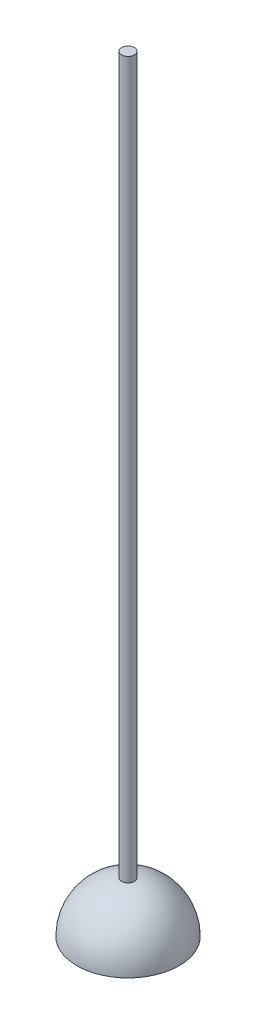
ISO-10303-21;
HEADER;
FILE_DESCRIPTION(('STEP AP214'),'2;1');
FILE_NAME('part.step','',(''),(''),'','','');
FILE_SCHEMA(('AUTOMOTIVE_DESIGN { 1 0 10303 214 1 1 1 1 }'));
ENDSEC;
DATA;
#1=APPLICATION_CONTEXT('core data for automotive mechanical design processes');
#2=APPLICATION_PROTOCOL_DEFINITION('international standard','automotive_design',2000,#1);
#3=PRODUCT_CONTEXT('',#1,'mechanical');
#4=PRODUCT('Part','Part','',(#3));
#5=PRODUCT_RELATED_PRODUCT_CATEGORY('part','',(#4));
#6=PRODUCT_DEFINITION_FORMATION('','',#4);
#7=PRODUCT_DEFINITION_CONTEXT('part definition',#1,'design');
#8=PRODUCT_DEFINITION('design','',#6,#7);
#9=PRODUCT_DEFINITION_SHAPE('','',#8);
#10=(LENGTH_UNIT() NAMED_UNIT(*) SI_UNIT(.MILLI.,.METRE.));
#11=(NAMED_UNIT(*) PLANE_ANGLE_UNIT() SI_UNIT($,.RADIAN.));
#12=(NAMED_UNIT(*) SI_UNIT($,.STERADIAN.) SOLID_ANGLE_UNIT());
#13=UNCERTAINTY_MEASURE_WITH_UNIT(LENGTH_MEASURE(1.E-05),#10,'distance_accuracy_value','');
#14=(GEOMETRIC_REPRESENTATION_CONTEXT(3) GLOBAL_UNCERTAINTY_ASSIGNED_CONTEXT((#13)) GLOBAL_UNIT_ASSIGNED_CONTEXT((#10,
#11,#12)) REPRESENTATION_CONTEXT('',''));
#15=CARTESIAN_POINT('',(0.,0.,0.));
#16=DIRECTION('',(0.,0.,1.));
#17=DIRECTION('',(1.,0.,0.));
#18=AXIS2_PLACEMENT_3D('',#15,#16,#17);
#19=CARTESIAN_POINT('',(0.,0.,0.));
#20=DIRECTION('',(0.,-1.,0.));
#21=DIRECTION('',(1.,0.,0.));
#22=AXIS2_PLACEMENT_3D('',#19,#20,#21);
#23=SPHERICAL_SURFACE('',#22,100.);
#24=CARTESIAN_POINT('',(0.,99.2156741649222,0.));
#25=DIRECTION('',(0.,-1.,0.));
#26=DIRECTION('',(0.,0.,-1.));
#27=AXIS2_PLACEMENT_3D('',#24,#25,#26);
#28=CIRCLE('',#27,12.5);
#29=CARTESIAN_POINT('',(0.,99.2156741649222,-12.5));
#30=VERTEX_POINT('',#29);
#31=EDGE_CURVE('E50',#30,#30,#28,.T.);
#32=ORIENTED_EDGE('',*,*,#31,.T.);
#33=EDGE_LOOP('',(#32));
#34=FACE_BOUND('',#33,.T.);
#35=CARTESIAN_POINT('',(0.,0.,0.));
#36=DIRECTION('',(0.,-1.,0.));
#37=DIRECTION('',(0.,0.,-1.));
#38=AXIS2_PLACEMENT_3D('',#35,#36,#37);
#39=CIRCLE('',#38,100.);
#40=CARTESIAN_POINT('',(0.,0.,-100.));
#41=VERTEX_POINT('',#40);
#42=EDGE_CURVE('E10',#41,#41,#39,.T.);
#43=ORIENTED_EDGE('',*,*,#42,.F.);
#44=EDGE_LOOP('',(#43));
#45=FACE_BOUND('',#44,.T.);
#46=ADVANCED_FACE('F43',(#34,#45),#23,.T.);
#47=CARTESIAN_POINT('',(0.,0.,0.));
#48=DIRECTION('',(0.,1.,0.));
#49=DIRECTION('',(0.,0.,1.));
#50=AXIS2_PLACEMENT_3D('',#47,#48,#49);
#51=PLANE('',#50);
#52=ORIENTED_EDGE('',*,*,#42,.T.);
#53=EDGE_LOOP('',(#52));
#54=FACE_BOUND('',#53,.T.);
#55=ADVANCED_FACE('F72',(#54),#51,.F.);
#56=CARTESIAN_POINT('',(0.,1500.,0.));
#57=DIRECTION('',(0.,-1.,0.));
#58=DIRECTION('',(0.,0.,-1.));
#59=AXIS2_PLACEMENT_3D('',#56,#57,#58);
#60=CYLINDRICAL_SURFACE('',#59,12.5);
#61=CARTESIAN_POINT('',(0.,1500.,0.));
#62=DIRECTION('',(0.,-1.,0.));
#63=DIRECTION('',(0.,0.,-1.));
#64=AXIS2_PLACEMENT_3D('',#61,#62,#63);
#65=CIRCLE('',#64,12.5);
#66=CARTESIAN_POINT('',(0.,1500.,-12.5));
#67=VERTEX_POINT('',#66);
#68=EDGE_CURVE('E55',#67,#67,#65,.T.);
#69=ORIENTED_EDGE('',*,*,#68,.T.);
#70=EDGE_LOOP('',(#69));
#71=FACE_BOUND('',#70,.T.);
#72=ORIENTED_EDGE('',*,*,#31,.F.);
#73=EDGE_LOOP('',(#72));
#74=FACE_BOUND('',#73,.T.);
#75=ADVANCED_FACE('F63',(#71,#74),#60,.T.);
#76=CARTESIAN_POINT('',(0.,1500.,0.));
#77=DIRECTION('',(0.,-1.,0.));
#78=DIRECTION('',(0.,0.,-1.));
#79=AXIS2_PLACEMENT_3D('',#76,#77,#78);
#80=PLANE('',#79);
#81=ORIENTED_EDGE('',*,*,#68,.F.);
#82=EDGE_LOOP('',(#81));
#83=FACE_BOUND('',#82,.T.);
#84=ADVANCED_FACE('F66',(#83),#80,.F.);
#85=CLOSED_SHELL('',(#46,#55,#75,#84));
#86=MANIFOLD_SOLID_BREP('B2',#85);
#87=ADVANCED_BREP_SHAPE_REPRESENTATION('',(#18,#86),#14);
#88=SHAPE_DEFINITION_REPRESENTATION(#9,#87);
ENDSEC;
END-ISO-10303-21;
